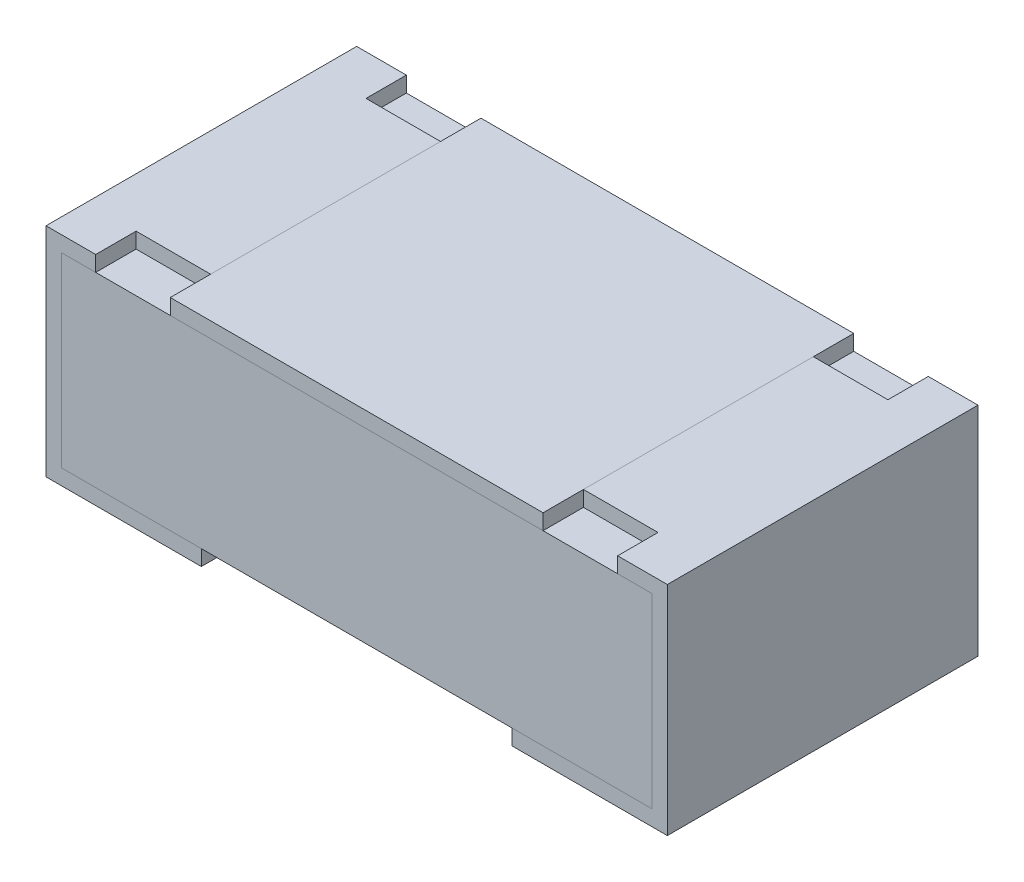
ISO-10303-21;
HEADER;
FILE_DESCRIPTION(('STEP AP214'),'2;1');
FILE_NAME('part.step','',(''),(''),'','','');
FILE_SCHEMA(('AUTOMOTIVE_DESIGN { 1 0 10303 214 1 1 1 1 }'));
ENDSEC;
DATA;
#1=APPLICATION_CONTEXT('core data for automotive mechanical design processes');
#2=APPLICATION_PROTOCOL_DEFINITION('international standard','automotive_design',2000,#1);
#3=PRODUCT_CONTEXT('',#1,'mechanical');
#4=PRODUCT('Part','Part','',(#3));
#5=PRODUCT_RELATED_PRODUCT_CATEGORY('part','',(#4));
#6=PRODUCT_DEFINITION_FORMATION('','',#4);
#7=PRODUCT_DEFINITION_CONTEXT('part definition',#1,'design');
#8=PRODUCT_DEFINITION('design','',#6,#7);
#9=PRODUCT_DEFINITION_SHAPE('','',#8);
#10=(LENGTH_UNIT() NAMED_UNIT(*) SI_UNIT(.MILLI.,.METRE.));
#11=(NAMED_UNIT(*) PLANE_ANGLE_UNIT() SI_UNIT($,.RADIAN.));
#12=(NAMED_UNIT(*) SI_UNIT($,.STERADIAN.) SOLID_ANGLE_UNIT());
#13=UNCERTAINTY_MEASURE_WITH_UNIT(LENGTH_MEASURE(1.E-05),#10,'distance_accuracy_value','');
#14=(GEOMETRIC_REPRESENTATION_CONTEXT(3) GLOBAL_UNCERTAINTY_ASSIGNED_CONTEXT((#13)) GLOBAL_UNIT_ASSIGNED_CONTEXT((#10,
#11,#12)) REPRESENTATION_CONTEXT('',''));
#15=CARTESIAN_POINT('',(0.,0.,0.));
#16=DIRECTION('',(0.,0.,1.));
#17=DIRECTION('',(1.,0.,0.));
#18=AXIS2_PLACEMENT_3D('',#15,#16,#17);
#19=CARTESIAN_POINT('',(-0.475,0.025,-0.25));
#20=DIRECTION('',(0.,-1.,0.));
#21=DIRECTION('',(0.,0.,-1.));
#22=AXIS2_PLACEMENT_3D('',#19,#20,#21);
#23=PLANE('',#22);
#24=DIRECTION('',(0.,0.,1.));
#25=VECTOR('',#24,1.);
#26=CARTESIAN_POINT('',(-0.25,0.025,-0.25));
#27=LINE('',#26,#25);
#28=CARTESIAN_POINT('',(-0.25,0.0250000000000003,-0.25));
#29=VERTEX_POINT('',#28);
#30=CARTESIAN_POINT('',(-0.25,0.025,0.25));
#31=VERTEX_POINT('',#30);
#32=EDGE_CURVE('P0_E151',#29,#31,#27,.T.);
#33=ORIENTED_EDGE('',*,*,#32,.F.);
#34=DIRECTION('',(1.,0.,0.));
#35=VECTOR('',#34,1.);
#36=CARTESIAN_POINT('',(-0.475,0.0250000000000002,-0.25));
#37=LINE('',#36,#35);
#38=CARTESIAN_POINT('',(-0.475,0.0250000000000002,-0.25));
#39=VERTEX_POINT('',#38);
#40=EDGE_CURVE('P0_E196',#39,#29,#37,.T.);
#41=ORIENTED_EDGE('',*,*,#40,.F.);
#42=DIRECTION('',(0.,0.,-1.));
#43=VECTOR('',#42,1.);
#44=CARTESIAN_POINT('',(-0.475,0.025,-0.25));
#45=LINE('',#44,#43);
#46=CARTESIAN_POINT('',(-0.475,0.0250000000000002,0.25));
#47=VERTEX_POINT('',#46);
#48=EDGE_CURVE('P0_E159',#47,#39,#45,.T.);
#49=ORIENTED_EDGE('',*,*,#48,.F.);
#50=DIRECTION('',(1.,0.,0.));
#51=VECTOR('',#50,1.);
#52=CARTESIAN_POINT('',(-0.475,0.0250000000000002,0.25));
#53=LINE('',#52,#51);
#54=EDGE_CURVE('P0_E158',#47,#31,#53,.T.);
#55=ORIENTED_EDGE('',*,*,#54,.T.);
#56=EDGE_LOOP('',(#33,#41,#49,#55));
#57=FACE_BOUND('',#56,.T.);
#58=ADVANCED_FACE('P0_F17',(#57),#23,.F.);
#59=CARTESIAN_POINT('',(-0.5,0.,0.25));
#60=DIRECTION('',(0.,1.,0.));
#61=DIRECTION('',(0.,0.,1.));
#62=AXIS2_PLACEMENT_3D('',#59,#60,#61);
#63=PLANE('',#62);
#64=DIRECTION('',(0.,0.,-1.));
#65=VECTOR('',#64,1.);
#66=CARTESIAN_POINT('',(-0.25,0.,0.25));
#67=LINE('',#66,#65);
#68=CARTESIAN_POINT('',(-0.25,0.,0.25));
#69=VERTEX_POINT('',#68);
#70=CARTESIAN_POINT('',(-0.25,0.,-0.25));
#71=VERTEX_POINT('',#70);
#72=EDGE_CURVE('P0_E11',#69,#71,#67,.T.);
#73=ORIENTED_EDGE('',*,*,#72,.F.);
#74=DIRECTION('',(1.,0.,0.));
#75=VECTOR('',#74,1.);
#76=CARTESIAN_POINT('',(-0.5,0.,0.25));
#77=LINE('',#76,#75);
#78=CARTESIAN_POINT('',(-0.5,0.,0.25));
#79=VERTEX_POINT('',#78);
#80=EDGE_CURVE('P0_E152',#79,#69,#77,.T.);
#81=ORIENTED_EDGE('',*,*,#80,.F.);
#82=DIRECTION('',(0.,0.,1.));
#83=VECTOR('',#82,1.);
#84=CARTESIAN_POINT('',(-0.5,0.,0.25));
#85=LINE('',#84,#83);
#86=CARTESIAN_POINT('',(-0.5,0.,-0.25));
#87=VERTEX_POINT('',#86);
#88=EDGE_CURVE('P0_E155',#87,#79,#85,.T.);
#89=ORIENTED_EDGE('',*,*,#88,.F.);
#90=DIRECTION('',(1.,0.,0.));
#91=VECTOR('',#90,1.);
#92=CARTESIAN_POINT('',(-0.5,0.,-0.25));
#93=LINE('',#92,#91);
#94=EDGE_CURVE('P0_E199',#87,#71,#93,.T.);
#95=ORIENTED_EDGE('',*,*,#94,.T.);
#96=EDGE_LOOP('',(#73,#81,#89,#95));
#97=FACE_BOUND('',#96,.T.);
#98=ADVANCED_FACE('P0_F19',(#97),#63,.F.);
#99=CARTESIAN_POINT('',(-0.475,0.325,-0.25));
#100=DIRECTION('',(1.,0.,0.));
#101=DIRECTION('',(0.,0.,-1.));
#102=AXIS2_PLACEMENT_3D('',#99,#100,#101);
#103=PLANE('',#102);
#104=DIRECTION('',(0.,-1.,0.));
#105=VECTOR('',#104,1.);
#106=CARTESIAN_POINT('',(-0.475,0.325,0.25));
#107=LINE('',#106,#105);
#108=CARTESIAN_POINT('',(-0.475,0.325,0.25));
#109=VERTEX_POINT('',#108);
#110=EDGE_CURVE('P0_E162',#109,#47,#107,.T.);
#111=ORIENTED_EDGE('',*,*,#110,.T.);
#112=ORIENTED_EDGE('',*,*,#48,.T.);
#113=DIRECTION('',(0.,-1.,0.));
#114=VECTOR('',#113,1.);
#115=CARTESIAN_POINT('',(-0.475,0.325,-0.25));
#116=LINE('',#115,#114);
#117=CARTESIAN_POINT('',(-0.475,0.325,-0.25));
#118=VERTEX_POINT('',#117);
#119=EDGE_CURVE('P0_E170',#118,#39,#116,.T.);
#120=ORIENTED_EDGE('',*,*,#119,.F.);
#121=DIRECTION('',(0.,0.,1.));
#122=VECTOR('',#121,1.);
#123=CARTESIAN_POINT('',(-0.475,0.325,-0.25));
#124=LINE('',#123,#122);
#125=EDGE_CURVE('P0_E166',#118,#109,#124,.T.);
#126=ORIENTED_EDGE('',*,*,#125,.T.);
#127=EDGE_LOOP('',(#111,#112,#120,#126));
#128=FACE_BOUND('',#127,.T.);
#129=ADVANCED_FACE('P0_F220',(#128),#103,.T.);
#130=CARTESIAN_POINT('',(-0.5,0.35,0.25));
#131=DIRECTION('',(-1.,0.,0.));
#132=DIRECTION('',(0.,0.,1.));
#133=AXIS2_PLACEMENT_3D('',#130,#131,#132);
#134=PLANE('',#133);
#135=DIRECTION('',(0.,-1.,0.));
#136=VECTOR('',#135,1.);
#137=CARTESIAN_POINT('',(-0.5,0.35,-0.25));
#138=LINE('',#137,#136);
#139=CARTESIAN_POINT('',(-0.5,0.35,-0.25));
#140=VERTEX_POINT('',#139);
#141=EDGE_CURVE('P0_E186',#140,#87,#138,.T.);
#142=ORIENTED_EDGE('',*,*,#141,.T.);
#143=ORIENTED_EDGE('',*,*,#88,.T.);
#144=DIRECTION('',(0.,-1.,0.));
#145=VECTOR('',#144,1.);
#146=CARTESIAN_POINT('',(-0.5,0.35,0.25));
#147=LINE('',#146,#145);
#148=CARTESIAN_POINT('',(-0.5,0.35,0.25));
#149=VERTEX_POINT('',#148);
#150=EDGE_CURVE('P0_E189',#149,#79,#147,.T.);
#151=ORIENTED_EDGE('',*,*,#150,.F.);
#152=DIRECTION('',(0.,0.,-1.));
#153=VECTOR('',#152,1.);
#154=CARTESIAN_POINT('',(-0.5,0.35,0.25));
#155=LINE('',#154,#153);
#156=EDGE_CURVE('P0_E163',#149,#140,#155,.T.);
#157=ORIENTED_EDGE('',*,*,#156,.T.);
#158=EDGE_LOOP('',(#142,#143,#151,#157));
#159=FACE_BOUND('',#158,.T.);
#160=ADVANCED_FACE('P0_F253',(#159),#134,.T.);
#161=CARTESIAN_POINT('',(-0.98812460986252,0.325,-0.25));
#162=DIRECTION('',(0.,1.,0.));
#163=DIRECTION('',(-1.,0.,0.));
#164=AXIS2_PLACEMENT_3D('',#161,#162,#163);
#165=PLANE('',#164);
#166=DIRECTION('',(-1.,0.,0.));
#167=VECTOR('',#166,1.);
#168=CARTESIAN_POINT('',(-0.3,0.325,0.185));
#169=LINE('',#168,#167);
#170=CARTESIAN_POINT('',(-0.3,0.325,0.185));
#171=VERTEX_POINT('',#170);
#172=CARTESIAN_POINT('',(-0.42,0.325,0.185));
#173=VERTEX_POINT('',#172);
#174=EDGE_CURVE('P0_E40',#171,#173,#169,.T.);
#175=ORIENTED_EDGE('',*,*,#174,.T.);
#176=DIRECTION('',(0.,0.,1.));
#177=VECTOR('',#176,1.);
#178=CARTESIAN_POINT('',(-0.42,0.325,0.25));
#179=LINE('',#178,#177);
#180=CARTESIAN_POINT('',(-0.42,0.325,0.25));
#181=VERTEX_POINT('',#180);
#182=EDGE_CURVE('P0_E114',#173,#181,#179,.T.);
#183=ORIENTED_EDGE('',*,*,#182,.T.);
#184=DIRECTION('',(1.,0.,0.));
#185=VECTOR('',#184,1.);
#186=CARTESIAN_POINT('',(-0.98812460986252,0.325,0.25));
#187=LINE('',#186,#185);
#188=EDGE_CURVE('P0_E174',#109,#181,#187,.T.);
#189=ORIENTED_EDGE('',*,*,#188,.F.);
#190=ORIENTED_EDGE('',*,*,#125,.F.);
#191=DIRECTION('',(1.,0.,0.));
#192=VECTOR('',#191,1.);
#193=CARTESIAN_POINT('',(-0.98812460986252,0.325,-0.25));
#194=LINE('',#193,#192);
#195=CARTESIAN_POINT('',(-0.42,0.325,-0.25));
#196=VERTEX_POINT('',#195);
#197=EDGE_CURVE('P0_E176',#118,#196,#194,.T.);
#198=ORIENTED_EDGE('',*,*,#197,.T.);
#199=DIRECTION('',(0.,0.,1.));
#200=VECTOR('',#199,1.);
#201=CARTESIAN_POINT('',(-0.42,0.325,-0.25));
#202=LINE('',#201,#200);
#203=CARTESIAN_POINT('',(-0.42,0.325,-0.185));
#204=VERTEX_POINT('',#203);
#205=EDGE_CURVE('P0_E135',#196,#204,#202,.T.);
#206=ORIENTED_EDGE('',*,*,#205,.T.);
#207=DIRECTION('',(1.,0.,0.));
#208=VECTOR('',#207,1.);
#209=CARTESIAN_POINT('',(-0.3,0.325,-0.185));
#210=LINE('',#209,#208);
#211=CARTESIAN_POINT('',(-0.3,0.325,-0.185));
#212=VERTEX_POINT('',#211);
#213=EDGE_CURVE('P0_E138',#204,#212,#210,.T.);
#214=ORIENTED_EDGE('',*,*,#213,.T.);
#215=DIRECTION('',(0.,0.,1.));
#216=VECTOR('',#215,1.);
#217=CARTESIAN_POINT('',(-0.3,0.325,-0.25));
#218=LINE('',#217,#216);
#219=EDGE_CURVE('P0_E125',#212,#171,#218,.T.);
#220=ORIENTED_EDGE('',*,*,#219,.T.);
#221=EDGE_LOOP('',(#175,#183,#189,#190,#198,#206,#214,#220));
#222=FACE_BOUND('',#221,.T.);
#223=ADVANCED_FACE('P0_F122',(#222),#165,.F.);
#224=CARTESIAN_POINT('',(-0.98812460986252,0.35,-0.25));
#225=DIRECTION('',(0.,0.,1.));
#226=DIRECTION('',(1.,0.,0.));
#227=AXIS2_PLACEMENT_3D('',#224,#225,#226);
#228=PLANE('',#227);
#229=DIRECTION('',(1.,0.,0.));
#230=VECTOR('',#229,1.);
#231=CARTESIAN_POINT('',(-0.98812460986252,0.35,-0.25));
#232=LINE('',#231,#230);
#233=CARTESIAN_POINT('',(-0.42,0.35,-0.25));
#234=VERTEX_POINT('',#233);
#235=EDGE_CURVE('P0_E179',#140,#234,#232,.T.);
#236=ORIENTED_EDGE('',*,*,#235,.T.);
#237=DIRECTION('',(0.,1.,0.));
#238=VECTOR('',#237,1.);
#239=CARTESIAN_POINT('',(-0.42,0.325,-0.25));
#240=LINE('',#239,#238);
#241=EDGE_CURVE('P0_E140',#196,#234,#240,.T.);
#242=ORIENTED_EDGE('',*,*,#241,.F.);
#243=ORIENTED_EDGE('',*,*,#197,.F.);
#244=ORIENTED_EDGE('',*,*,#119,.T.);
#245=ORIENTED_EDGE('',*,*,#40,.T.);
#246=DIRECTION('',(0.,1.,0.));
#247=VECTOR('',#246,1.);
#248=CARTESIAN_POINT('',(-0.25,0.175,-0.25));
#249=LINE('',#248,#247);
#250=EDGE_CURVE('P0_E149',#71,#29,#249,.T.);
#251=ORIENTED_EDGE('',*,*,#250,.F.);
#252=ORIENTED_EDGE('',*,*,#94,.F.);
#253=ORIENTED_EDGE('',*,*,#141,.F.);
#254=EDGE_LOOP('',(#236,#242,#243,#244,#245,#251,#252,#253));
#255=FACE_BOUND('',#254,.T.);
#256=ADVANCED_FACE('P0_F214',(#255),#228,.F.);
#257=CARTESIAN_POINT('',(-0.98812460986252,0.35,0.25));
#258=DIRECTION('',(0.,-1.,0.));
#259=DIRECTION('',(1.,0.,0.));
#260=AXIS2_PLACEMENT_3D('',#257,#258,#259);
#261=PLANE('',#260);
#262=DIRECTION('',(1.,0.,0.));
#263=VECTOR('',#262,1.);
#264=CARTESIAN_POINT('',(-0.98812460986252,0.35,0.25));
#265=LINE('',#264,#263);
#266=CARTESIAN_POINT('',(-0.42,0.35,0.25));
#267=VERTEX_POINT('',#266);
#268=EDGE_CURVE('P0_E167',#149,#267,#265,.T.);
#269=ORIENTED_EDGE('',*,*,#268,.T.);
#270=DIRECTION('',(0.,0.,1.));
#271=VECTOR('',#270,1.);
#272=CARTESIAN_POINT('',(-0.42,0.35,0.25));
#273=LINE('',#272,#271);
#274=CARTESIAN_POINT('',(-0.42,0.35,0.185));
#275=VERTEX_POINT('',#274);
#276=EDGE_CURVE('P0_E126',#275,#267,#273,.T.);
#277=ORIENTED_EDGE('',*,*,#276,.F.);
#278=DIRECTION('',(-1.,0.,0.));
#279=VECTOR('',#278,1.);
#280=CARTESIAN_POINT('',(-0.3,0.35,0.185));
#281=LINE('',#280,#279);
#282=CARTESIAN_POINT('',(-0.3,0.35,0.185));
#283=VERTEX_POINT('',#282);
#284=EDGE_CURVE('P0_E107',#283,#275,#281,.T.);
#285=ORIENTED_EDGE('',*,*,#284,.F.);
#286=DIRECTION('',(0.,0.,-1.));
#287=VECTOR('',#286,1.);
#288=CARTESIAN_POINT('',(-0.3,0.35,0.25));
#289=LINE('',#288,#287);
#290=CARTESIAN_POINT('',(-0.3,0.35,-0.185));
#291=VERTEX_POINT('',#290);
#292=EDGE_CURVE('P0_E132',#283,#291,#289,.T.);
#293=ORIENTED_EDGE('',*,*,#292,.T.);
#294=DIRECTION('',(1.,0.,0.));
#295=VECTOR('',#294,1.);
#296=CARTESIAN_POINT('',(-0.3,0.35,-0.185));
#297=LINE('',#296,#295);
#298=CARTESIAN_POINT('',(-0.42,0.35,-0.185));
#299=VERTEX_POINT('',#298);
#300=EDGE_CURVE('P0_E32',#299,#291,#297,.T.);
#301=ORIENTED_EDGE('',*,*,#300,.F.);
#302=DIRECTION('',(0.,0.,1.));
#303=VECTOR('',#302,1.);
#304=CARTESIAN_POINT('',(-0.42,0.35,-0.25));
#305=LINE('',#304,#303);
#306=EDGE_CURVE('P0_E141',#234,#299,#305,.T.);
#307=ORIENTED_EDGE('',*,*,#306,.F.);
#308=ORIENTED_EDGE('',*,*,#235,.F.);
#309=ORIENTED_EDGE('',*,*,#156,.F.);
#310=EDGE_LOOP('',(#269,#277,#285,#293,#301,#307,#308,#309));
#311=FACE_BOUND('',#310,.T.);
#312=ADVANCED_FACE('P0_F227',(#311),#261,.F.);
#313=CARTESIAN_POINT('',(-0.98812460986252,0.325,0.25));
#314=DIRECTION('',(0.,0.,-1.));
#315=DIRECTION('',(0.,1.,0.));
#316=AXIS2_PLACEMENT_3D('',#313,#314,#315);
#317=PLANE('',#316);
#318=ORIENTED_EDGE('',*,*,#188,.T.);
#319=DIRECTION('',(0.,1.,0.));
#320=VECTOR('',#319,1.);
#321=CARTESIAN_POINT('',(-0.42,0.325,0.25));
#322=LINE('',#321,#320);
#323=EDGE_CURVE('P0_E110',#181,#267,#322,.T.);
#324=ORIENTED_EDGE('',*,*,#323,.T.);
#325=ORIENTED_EDGE('',*,*,#268,.F.);
#326=ORIENTED_EDGE('',*,*,#150,.T.);
#327=ORIENTED_EDGE('',*,*,#80,.T.);
#328=DIRECTION('',(0.,-1.,0.));
#329=VECTOR('',#328,1.);
#330=CARTESIAN_POINT('',(-0.25,0.175,0.25));
#331=LINE('',#330,#329);
#332=EDGE_CURVE('P0_E25',#31,#69,#331,.T.);
#333=ORIENTED_EDGE('',*,*,#332,.F.);
#334=ORIENTED_EDGE('',*,*,#54,.F.);
#335=ORIENTED_EDGE('',*,*,#110,.F.);
#336=EDGE_LOOP('',(#318,#324,#325,#326,#327,#333,#334,#335));
#337=FACE_BOUND('',#336,.T.);
#338=ADVANCED_FACE('P0_F205',(#337),#317,.F.);
#339=CARTESIAN_POINT('',(-0.3,0.35,0.25));
#340=DIRECTION('',(-1.,0.,0.));
#341=DIRECTION('',(0.,0.,1.));
#342=AXIS2_PLACEMENT_3D('',#339,#340,#341);
#343=PLANE('',#342);
#344=ORIENTED_EDGE('',*,*,#292,.F.);
#345=DIRECTION('',(0.,1.,0.));
#346=VECTOR('',#345,1.);
#347=CARTESIAN_POINT('',(-0.3,0.325,0.185));
#348=LINE('',#347,#346);
#349=EDGE_CURVE('P0_E111',#171,#283,#348,.T.);
#350=ORIENTED_EDGE('',*,*,#349,.F.);
#351=ORIENTED_EDGE('',*,*,#219,.F.);
#352=DIRECTION('',(0.,1.,0.));
#353=VECTOR('',#352,1.);
#354=CARTESIAN_POINT('',(-0.3,0.325,-0.185));
#355=LINE('',#354,#353);
#356=EDGE_CURVE('P0_E130',#212,#291,#355,.T.);
#357=ORIENTED_EDGE('',*,*,#356,.T.);
#358=EDGE_LOOP('',(#344,#350,#351,#357));
#359=FACE_BOUND('',#358,.T.);
#360=ADVANCED_FACE('P0_F231',(#359),#343,.F.);
#361=CARTESIAN_POINT('',(-0.25,0.0125000000000001,0.));
#362=DIRECTION('',(1.,0.,0.));
#363=DIRECTION('',(0.,0.,-1.));
#364=AXIS2_PLACEMENT_3D('',#361,#362,#363);
#365=PLANE('',#364);
#366=ORIENTED_EDGE('',*,*,#332,.T.);
#367=ORIENTED_EDGE('',*,*,#72,.T.);
#368=ORIENTED_EDGE('',*,*,#250,.T.);
#369=ORIENTED_EDGE('',*,*,#32,.T.);
#370=EDGE_LOOP('',(#366,#367,#368,#369));
#371=FACE_BOUND('',#370,.T.);
#372=ADVANCED_FACE('P0_F211',(#371),#365,.T.);
#373=CARTESIAN_POINT('',(-0.3,0.325,-0.185));
#374=DIRECTION('',(0.,0.,1.));
#375=DIRECTION('',(1.,0.,0.));
#376=AXIS2_PLACEMENT_3D('',#373,#374,#375);
#377=PLANE('',#376);
#378=ORIENTED_EDGE('',*,*,#300,.T.);
#379=ORIENTED_EDGE('',*,*,#356,.F.);
#380=ORIENTED_EDGE('',*,*,#213,.F.);
#381=DIRECTION('',(0.,1.,0.));
#382=VECTOR('',#381,1.);
#383=CARTESIAN_POINT('',(-0.42,0.325,-0.185));
#384=LINE('',#383,#382);
#385=EDGE_CURVE('P0_E146',#204,#299,#384,.T.);
#386=ORIENTED_EDGE('',*,*,#385,.T.);
#387=EDGE_LOOP('',(#378,#379,#380,#386));
#388=FACE_BOUND('',#387,.T.);
#389=ADVANCED_FACE('P0_F233',(#388),#377,.F.);
#390=CARTESIAN_POINT('',(-0.42,0.325,-0.25));
#391=DIRECTION('',(-1.,0.,0.));
#392=DIRECTION('',(0.,-1.,0.));
#393=AXIS2_PLACEMENT_3D('',#390,#391,#392);
#394=PLANE('',#393);
#395=ORIENTED_EDGE('',*,*,#306,.T.);
#396=ORIENTED_EDGE('',*,*,#385,.F.);
#397=ORIENTED_EDGE('',*,*,#205,.F.);
#398=ORIENTED_EDGE('',*,*,#241,.T.);
#399=EDGE_LOOP('',(#395,#396,#397,#398));
#400=FACE_BOUND('',#399,.T.);
#401=ADVANCED_FACE('P0_F225',(#400),#394,.F.);
#402=CARTESIAN_POINT('',(-0.42,0.325,0.25));
#403=DIRECTION('',(-1.,0.,0.));
#404=DIRECTION('',(0.,-1.,0.));
#405=AXIS2_PLACEMENT_3D('',#402,#403,#404);
#406=PLANE('',#405);
#407=ORIENTED_EDGE('',*,*,#276,.T.);
#408=ORIENTED_EDGE('',*,*,#323,.F.);
#409=ORIENTED_EDGE('',*,*,#182,.F.);
#410=DIRECTION('',(0.,1.,0.));
#411=VECTOR('',#410,1.);
#412=CARTESIAN_POINT('',(-0.42,0.325,0.185));
#413=LINE('',#412,#411);
#414=EDGE_CURVE('P0_E103',#173,#275,#413,.T.);
#415=ORIENTED_EDGE('',*,*,#414,.T.);
#416=EDGE_LOOP('',(#407,#408,#409,#415));
#417=FACE_BOUND('',#416,.T.);
#418=ADVANCED_FACE('P0_F115',(#417),#406,.F.);
#419=CARTESIAN_POINT('',(-0.3,0.325,0.185));
#420=DIRECTION('',(0.,0.,-1.));
#421=DIRECTION('',(-1.,0.,0.));
#422=AXIS2_PLACEMENT_3D('',#419,#420,#421);
#423=PLANE('',#422);
#424=ORIENTED_EDGE('',*,*,#284,.T.);
#425=ORIENTED_EDGE('',*,*,#414,.F.);
#426=ORIENTED_EDGE('',*,*,#174,.F.);
#427=ORIENTED_EDGE('',*,*,#349,.T.);
#428=EDGE_LOOP('',(#424,#425,#426,#427));
#429=FACE_BOUND('',#428,.T.);
#430=ADVANCED_FACE('P0_F105',(#429),#423,.F.);
#431=CLOSED_SHELL('',(#58,#98,#129,#160,#223,#256,#312,#338,#360,#372,#389,#401,#418,#430));
#432=MANIFOLD_SOLID_BREP('P0_B1',#431);
#433=CARTESIAN_POINT('',(0.3,0.35,0.25));
#434=DIRECTION('',(1.,0.,0.));
#435=DIRECTION('',(0.,0.,1.));
#436=AXIS2_PLACEMENT_3D('',#433,#434,#435);
#437=PLANE('',#436);
#438=DIRECTION('',(0.,-1.,0.));
#439=VECTOR('',#438,1.);
#440=CARTESIAN_POINT('',(0.3,0.35,-0.25));
#441=LINE('',#440,#439);
#442=CARTESIAN_POINT('',(0.299999999981537,0.35,-0.25));
#443=VERTEX_POINT('',#442);
#444=CARTESIAN_POINT('',(0.299999999981537,0.325,-0.25));
#445=VERTEX_POINT('',#444);
#446=EDGE_CURVE('P1_E70',#443,#445,#441,.T.);
#447=ORIENTED_EDGE('',*,*,#446,.F.);
#448=DIRECTION('',(0.,0.,-1.));
#449=VECTOR('',#448,1.);
#450=CARTESIAN_POINT('',(0.3,0.35,0.25));
#451=LINE('',#450,#449);
#452=CARTESIAN_POINT('',(0.299999999981537,0.35,0.25));
#453=VERTEX_POINT('',#452);
#454=EDGE_CURVE('P1_E74',#453,#443,#451,.T.);
#455=ORIENTED_EDGE('',*,*,#454,.F.);
#456=DIRECTION('',(0.,1.,0.));
#457=VECTOR('',#456,1.);
#458=CARTESIAN_POINT('',(0.3,0.325,0.25));
#459=LINE('',#458,#457);
#460=CARTESIAN_POINT('',(0.299999999981537,0.325,0.25));
#461=VERTEX_POINT('',#460);
#462=EDGE_CURVE('P1_E71',#461,#453,#459,.T.);
#463=ORIENTED_EDGE('',*,*,#462,.F.);
#464=DIRECTION('',(0.,0.,1.));
#465=VECTOR('',#464,1.);
#466=CARTESIAN_POINT('',(0.3,0.325,-0.25));
#467=LINE('',#466,#465);
#468=EDGE_CURVE('P1_E60',#445,#461,#467,.T.);
#469=ORIENTED_EDGE('',*,*,#468,.F.);
#470=EDGE_LOOP('',(#447,#455,#463,#469));
#471=FACE_BOUND('',#470,.T.);
#472=ADVANCED_FACE('P1_F17',(#471),#437,.T.);
#473=CARTESIAN_POINT('',(500000.,0.325,0.249999999901436));
#474=DIRECTION('',(0.,1.,0.));
#475=DIRECTION('',(-1.,0.,0.));
#476=AXIS2_PLACEMENT_3D('',#473,#474,#475);
#477=PLANE('',#476);
#478=DIRECTION('',(-1.,0.,0.));
#479=VECTOR('',#478,1.);
#480=CARTESIAN_POINT('',(500000.,0.325,-0.250000000098564));
#481=LINE('',#480,#479);
#482=CARTESIAN_POINT('',(-0.3,0.325,-0.25));
#483=VERTEX_POINT('',#482);
#484=EDGE_CURVE('P1_E67',#445,#483,#481,.T.);
#485=ORIENTED_EDGE('',*,*,#484,.F.);
#486=ORIENTED_EDGE('',*,*,#468,.T.);
#487=DIRECTION('',(-1.,0.,0.));
#488=VECTOR('',#487,1.);
#489=CARTESIAN_POINT('',(500000.,0.325,0.249999999901436));
#490=LINE('',#489,#488);
#491=CARTESIAN_POINT('',(-0.3,0.325,0.25));
#492=VERTEX_POINT('',#491);
#493=EDGE_CURVE('P1_E64',#461,#492,#490,.T.);
#494=ORIENTED_EDGE('',*,*,#493,.T.);
#495=DIRECTION('',(0.,0.,-1.));
#496=VECTOR('',#495,1.);
#497=CARTESIAN_POINT('',(-0.3,0.325,0.25));
#498=LINE('',#497,#496);
#499=EDGE_CURVE('P1_E26',#492,#483,#498,.T.);
#500=ORIENTED_EDGE('',*,*,#499,.T.);
#501=EDGE_LOOP('',(#485,#486,#494,#500));
#502=FACE_BOUND('',#501,.T.);
#503=ADVANCED_FACE('P1_F62',(#502),#477,.F.);
#504=CARTESIAN_POINT('',(-0.3,0.325,0.25));
#505=DIRECTION('',(1.,0.,0.));
#506=DIRECTION('',(0.,0.,-1.));
#507=AXIS2_PLACEMENT_3D('',#504,#505,#506);
#508=PLANE('',#507);
#509=DIRECTION('',(0.,1.,0.));
#510=VECTOR('',#509,1.);
#511=CARTESIAN_POINT('',(-0.3,0.35,-0.25));
#512=LINE('',#511,#510);
#513=CARTESIAN_POINT('',(-0.3,0.35,-0.25));
#514=VERTEX_POINT('',#513);
#515=EDGE_CURVE('P1_E82',#483,#514,#512,.T.);
#516=ORIENTED_EDGE('',*,*,#515,.F.);
#517=ORIENTED_EDGE('',*,*,#499,.F.);
#518=DIRECTION('',(0.,-1.,0.));
#519=VECTOR('',#518,1.);
#520=CARTESIAN_POINT('',(-0.3,0.35,0.25));
#521=LINE('',#520,#519);
#522=CARTESIAN_POINT('',(-0.3,0.35,0.25));
#523=VERTEX_POINT('',#522);
#524=EDGE_CURVE('P1_E11',#523,#492,#521,.T.);
#525=ORIENTED_EDGE('',*,*,#524,.F.);
#526=DIRECTION('',(0.,0.,1.));
#527=VECTOR('',#526,1.);
#528=CARTESIAN_POINT('',(-0.3,0.35,0.25));
#529=LINE('',#528,#527);
#530=EDGE_CURVE('P1_E34',#514,#523,#529,.T.);
#531=ORIENTED_EDGE('',*,*,#530,.F.);
#532=EDGE_LOOP('',(#516,#517,#525,#531));
#533=FACE_BOUND('',#532,.T.);
#534=ADVANCED_FACE('P1_F90',(#533),#508,.F.);
#535=CARTESIAN_POINT('',(500000.,0.35,-0.250000000098564));
#536=DIRECTION('',(0.,0.,1.));
#537=DIRECTION('',(1.,0.,0.));
#538=AXIS2_PLACEMENT_3D('',#535,#536,#537);
#539=PLANE('',#538);
#540=DIRECTION('',(-1.,0.,0.));
#541=VECTOR('',#540,1.);
#542=CARTESIAN_POINT('',(500000.,0.35,-0.250000000098564));
#543=LINE('',#542,#541);
#544=EDGE_CURVE('P1_E39',#443,#514,#543,.T.);
#545=ORIENTED_EDGE('',*,*,#544,.F.);
#546=ORIENTED_EDGE('',*,*,#446,.T.);
#547=ORIENTED_EDGE('',*,*,#484,.T.);
#548=ORIENTED_EDGE('',*,*,#515,.T.);
#549=EDGE_LOOP('',(#545,#546,#547,#548));
#550=FACE_BOUND('',#549,.T.);
#551=ADVANCED_FACE('P1_F87',(#550),#539,.F.);
#552=CARTESIAN_POINT('',(500000.,0.35,0.249999999901436));
#553=DIRECTION('',(0.,0.,-1.));
#554=DIRECTION('',(-1.,0.,0.));
#555=AXIS2_PLACEMENT_3D('',#552,#553,#554);
#556=PLANE('',#555);
#557=ORIENTED_EDGE('',*,*,#493,.F.);
#558=ORIENTED_EDGE('',*,*,#462,.T.);
#559=DIRECTION('',(-1.,0.,0.));
#560=VECTOR('',#559,1.);
#561=CARTESIAN_POINT('',(500000.,0.35,0.249999999901436));
#562=LINE('',#561,#560);
#563=EDGE_CURVE('P1_E21',#453,#523,#562,.T.);
#564=ORIENTED_EDGE('',*,*,#563,.T.);
#565=ORIENTED_EDGE('',*,*,#524,.T.);
#566=EDGE_LOOP('',(#557,#558,#564,#565));
#567=FACE_BOUND('',#566,.T.);
#568=ADVANCED_FACE('P1_F19',(#567),#556,.F.);
#569=CARTESIAN_POINT('',(500000.,0.35,0.249999999901436));
#570=DIRECTION('',(0.,-1.,0.));
#571=DIRECTION('',(1.,0.,0.));
#572=AXIS2_PLACEMENT_3D('',#569,#570,#571);
#573=PLANE('',#572);
#574=ORIENTED_EDGE('',*,*,#563,.F.);
#575=ORIENTED_EDGE('',*,*,#454,.T.);
#576=ORIENTED_EDGE('',*,*,#544,.T.);
#577=ORIENTED_EDGE('',*,*,#530,.T.);
#578=EDGE_LOOP('',(#574,#575,#576,#577));
#579=FACE_BOUND('',#578,.T.);
#580=ADVANCED_FACE('P1_F102',(#579),#573,.F.);
#581=CLOSED_SHELL('',(#472,#503,#534,#551,#568,#580));
#582=MANIFOLD_SOLID_BREP('P1_B1',#581);
#583=CARTESIAN_POINT('',(-0.475,0.35,-0.25));
#584=DIRECTION('',(1.,0.,0.));
#585=DIRECTION('',(0.,0.,-1.));
#586=AXIS2_PLACEMENT_3D('',#583,#584,#585);
#587=PLANE('',#586);
#588=DIRECTION('',(0.,-1.,0.));
#589=VECTOR('',#588,1.);
#590=CARTESIAN_POINT('',(-0.475,0.35,0.25));
#591=LINE('',#590,#589);
#592=CARTESIAN_POINT('',(-0.475,0.325,0.25));
#593=VERTEX_POINT('',#592);
#594=CARTESIAN_POINT('',(-0.475,0.025,0.25));
#595=VERTEX_POINT('',#594);
#596=EDGE_CURVE('P2_E11',#593,#595,#591,.T.);
#597=ORIENTED_EDGE('',*,*,#596,.F.);
#598=DIRECTION('',(0.,0.,1.));
#599=VECTOR('',#598,1.);
#600=CARTESIAN_POINT('',(-0.475,0.325,-0.25));
#601=LINE('',#600,#599);
#602=CARTESIAN_POINT('',(-0.475,0.325,-0.25));
#603=VERTEX_POINT('',#602);
#604=EDGE_CURVE('P2_E56',#603,#593,#601,.T.);
#605=ORIENTED_EDGE('',*,*,#604,.F.);
#606=DIRECTION('',(0.,-1.,0.));
#607=VECTOR('',#606,1.);
#608=CARTESIAN_POINT('',(-0.475,0.35,-0.25));
#609=LINE('',#608,#607);
#610=CARTESIAN_POINT('',(-0.475,0.025,-0.25));
#611=VERTEX_POINT('',#610);
#612=EDGE_CURVE('P2_E38',#603,#611,#609,.T.);
#613=ORIENTED_EDGE('',*,*,#612,.T.);
#614=DIRECTION('',(0.,0.,1.));
#615=VECTOR('',#614,1.);
#616=CARTESIAN_POINT('',(-0.475,0.025,-0.25));
#617=LINE('',#616,#615);
#618=EDGE_CURVE('P2_E70',#611,#595,#617,.T.);
#619=ORIENTED_EDGE('',*,*,#618,.T.);
#620=EDGE_LOOP('',(#597,#605,#613,#619));
#621=FACE_BOUND('',#620,.T.);
#622=ADVANCED_FACE('P2_F17',(#621),#587,.F.);
#623=CARTESIAN_POINT('',(0.475,0.35,0.25));
#624=DIRECTION('',(0.,0.,-1.));
#625=DIRECTION('',(-1.,0.,0.));
#626=AXIS2_PLACEMENT_3D('',#623,#624,#625);
#627=PLANE('',#626);
#628=DIRECTION('',(0.,-1.,0.));
#629=VECTOR('',#628,1.);
#630=CARTESIAN_POINT('',(0.475,0.35,0.25));
#631=LINE('',#630,#629);
#632=CARTESIAN_POINT('',(0.475,0.325,0.25));
#633=VERTEX_POINT('',#632);
#634=CARTESIAN_POINT('',(0.475,0.025,0.25));
#635=VERTEX_POINT('',#634);
#636=EDGE_CURVE('P2_E24',#633,#635,#631,.T.);
#637=ORIENTED_EDGE('',*,*,#636,.F.);
#638=DIRECTION('',(1.,0.,0.));
#639=VECTOR('',#638,1.);
#640=CARTESIAN_POINT('',(-0.475,0.325,0.25));
#641=LINE('',#640,#639);
#642=EDGE_CURVE('P2_E61',#593,#633,#641,.T.);
#643=ORIENTED_EDGE('',*,*,#642,.F.);
#644=ORIENTED_EDGE('',*,*,#596,.T.);
#645=DIRECTION('',(-1.,0.,0.));
#646=VECTOR('',#645,1.);
#647=CARTESIAN_POINT('',(-0.475,0.025,0.25));
#648=LINE('',#647,#646);
#649=EDGE_CURVE('P2_E86',#635,#595,#648,.T.);
#650=ORIENTED_EDGE('',*,*,#649,.F.);
#651=EDGE_LOOP('',(#637,#643,#644,#650));
#652=FACE_BOUND('',#651,.T.);
#653=ADVANCED_FACE('P2_F87',(#652),#627,.F.);
#654=CARTESIAN_POINT('',(0.475,0.35,-0.25));
#655=DIRECTION('',(-1.,0.,0.));
#656=DIRECTION('',(0.,0.,1.));
#657=AXIS2_PLACEMENT_3D('',#654,#655,#656);
#658=PLANE('',#657);
#659=DIRECTION('',(0.,-1.,0.));
#660=VECTOR('',#659,1.);
#661=CARTESIAN_POINT('',(0.475,0.35,-0.25));
#662=LINE('',#661,#660);
#663=CARTESIAN_POINT('',(0.475,0.325,-0.25));
#664=VERTEX_POINT('',#663);
#665=CARTESIAN_POINT('',(0.475,0.025,-0.25));
#666=VERTEX_POINT('',#665);
#667=EDGE_CURVE('P2_E69',#664,#666,#662,.T.);
#668=ORIENTED_EDGE('',*,*,#667,.F.);
#669=DIRECTION('',(0.,0.,1.));
#670=VECTOR('',#669,1.);
#671=CARTESIAN_POINT('',(0.475,0.325,-0.25));
#672=LINE('',#671,#670);
#673=EDGE_CURVE('P2_E59',#664,#633,#672,.T.);
#674=ORIENTED_EDGE('',*,*,#673,.T.);
#675=ORIENTED_EDGE('',*,*,#636,.T.);
#676=DIRECTION('',(0.,0.,1.));
#677=VECTOR('',#676,1.);
#678=CARTESIAN_POINT('',(0.475,0.025,-0.25));
#679=LINE('',#678,#677);
#680=EDGE_CURVE('P2_E73',#666,#635,#679,.T.);
#681=ORIENTED_EDGE('',*,*,#680,.F.);
#682=EDGE_LOOP('',(#668,#674,#675,#681));
#683=FACE_BOUND('',#682,.T.);
#684=ADVANCED_FACE('P2_F80',(#683),#658,.F.);
#685=CARTESIAN_POINT('',(0.475,0.35,-0.25));
#686=DIRECTION('',(0.,0.,1.));
#687=DIRECTION('',(1.,0.,0.));
#688=AXIS2_PLACEMENT_3D('',#685,#686,#687);
#689=PLANE('',#688);
#690=ORIENTED_EDGE('',*,*,#612,.F.);
#691=DIRECTION('',(1.,0.,0.));
#692=VECTOR('',#691,1.);
#693=CARTESIAN_POINT('',(-0.475,0.325,-0.25));
#694=LINE('',#693,#692);
#695=EDGE_CURVE('P2_E31',#603,#664,#694,.T.);
#696=ORIENTED_EDGE('',*,*,#695,.T.);
#697=ORIENTED_EDGE('',*,*,#667,.T.);
#698=DIRECTION('',(-1.,0.,0.));
#699=VECTOR('',#698,1.);
#700=CARTESIAN_POINT('',(-0.475,0.025,-0.25));
#701=LINE('',#700,#699);
#702=EDGE_CURVE('P2_E68',#666,#611,#701,.T.);
#703=ORIENTED_EDGE('',*,*,#702,.T.);
#704=EDGE_LOOP('',(#690,#696,#697,#703));
#705=FACE_BOUND('',#704,.T.);
#706=ADVANCED_FACE('P2_F66',(#705),#689,.F.);
#707=CARTESIAN_POINT('',(-0.475,0.025,-0.25));
#708=DIRECTION('',(0.,1.,0.));
#709=DIRECTION('',(0.,0.,1.));
#710=AXIS2_PLACEMENT_3D('',#707,#708,#709);
#711=PLANE('',#710);
#712=ORIENTED_EDGE('',*,*,#649,.T.);
#713=ORIENTED_EDGE('',*,*,#618,.F.);
#714=ORIENTED_EDGE('',*,*,#702,.F.);
#715=ORIENTED_EDGE('',*,*,#680,.T.);
#716=EDGE_LOOP('',(#712,#713,#714,#715));
#717=FACE_BOUND('',#716,.T.);
#718=ADVANCED_FACE('P2_F85',(#717),#711,.F.);
#719=CARTESIAN_POINT('',(-0.475,0.325,-0.25));
#720=DIRECTION('',(0.,-1.,0.));
#721=DIRECTION('',(1.,0.,0.));
#722=AXIS2_PLACEMENT_3D('',#719,#720,#721);
#723=PLANE('',#722);
#724=ORIENTED_EDGE('',*,*,#642,.T.);
#725=ORIENTED_EDGE('',*,*,#673,.F.);
#726=ORIENTED_EDGE('',*,*,#695,.F.);
#727=ORIENTED_EDGE('',*,*,#604,.T.);
#728=EDGE_LOOP('',(#724,#725,#726,#727));
#729=FACE_BOUND('',#728,.T.);
#730=ADVANCED_FACE('P2_F55',(#729),#723,.F.);
#731=CLOSED_SHELL('',(#622,#653,#684,#706,#718,#730));
#732=MANIFOLD_SOLID_BREP('P2_B1',#731);
#733=CARTESIAN_POINT('',(0.475,0.0249999999999999,-0.25));
#734=DIRECTION('',(0.,-1.,0.));
#735=DIRECTION('',(0.,0.,-1.));
#736=AXIS2_PLACEMENT_3D('',#733,#734,#735);
#737=PLANE('',#736);
#738=DIRECTION('',(0.,0.,1.));
#739=VECTOR('',#738,1.);
#740=CARTESIAN_POINT('',(0.25,0.0249999999999999,-0.25));
#741=LINE('',#740,#739);
#742=CARTESIAN_POINT('',(0.25,0.0250000000000002,-0.25));
#743=VERTEX_POINT('',#742);
#744=CARTESIAN_POINT('',(0.25,0.0249999999999999,0.25));
#745=VERTEX_POINT('',#744);
#746=EDGE_CURVE('P3_E170',#743,#745,#741,.T.);
#747=ORIENTED_EDGE('',*,*,#746,.T.);
#748=DIRECTION('',(-1.,0.,0.));
#749=VECTOR('',#748,1.);
#750=CARTESIAN_POINT('',(0.475,0.0250000000000001,0.25));
#751=LINE('',#750,#749);
#752=CARTESIAN_POINT('',(0.475,0.0250000000000001,0.25));
#753=VERTEX_POINT('',#752);
#754=EDGE_CURVE('P3_E154',#753,#745,#751,.T.);
#755=ORIENTED_EDGE('',*,*,#754,.F.);
#756=DIRECTION('',(0.,0.,-1.));
#757=VECTOR('',#756,1.);
#758=CARTESIAN_POINT('',(0.475,0.0249999999999999,-0.25));
#759=LINE('',#758,#757);
#760=CARTESIAN_POINT('',(0.475,0.0250000000000001,-0.25));
#761=VERTEX_POINT('',#760);
#762=EDGE_CURVE('P3_E153',#753,#761,#759,.T.);
#763=ORIENTED_EDGE('',*,*,#762,.T.);
#764=DIRECTION('',(-1.,0.,0.));
#765=VECTOR('',#764,1.);
#766=CARTESIAN_POINT('',(0.475,0.0250000000000001,-0.25));
#767=LINE('',#766,#765);
#768=EDGE_CURVE('P3_E157',#761,#743,#767,.T.);
#769=ORIENTED_EDGE('',*,*,#768,.T.);
#770=EDGE_LOOP('',(#747,#755,#763,#769));
#771=FACE_BOUND('',#770,.T.);
#772=ADVANCED_FACE('P3_F17',(#771),#737,.F.);
#773=CARTESIAN_POINT('',(0.5,0.,0.25));
#774=DIRECTION('',(0.,1.,0.));
#775=DIRECTION('',(0.,0.,1.));
#776=AXIS2_PLACEMENT_3D('',#773,#774,#775);
#777=PLANE('',#776);
#778=DIRECTION('',(0.,0.,-1.));
#779=VECTOR('',#778,1.);
#780=CARTESIAN_POINT('',(0.25,0.,0.25));
#781=LINE('',#780,#779);
#782=CARTESIAN_POINT('',(0.25,0.,0.25));
#783=VERTEX_POINT('',#782);
#784=CARTESIAN_POINT('',(0.25,0.,-0.25));
#785=VERTEX_POINT('',#784);
#786=EDGE_CURVE('P3_E11',#783,#785,#781,.T.);
#787=ORIENTED_EDGE('',*,*,#786,.T.);
#788=DIRECTION('',(-1.,0.,0.));
#789=VECTOR('',#788,1.);
#790=CARTESIAN_POINT('',(0.5,0.,-0.25));
#791=LINE('',#790,#789);
#792=CARTESIAN_POINT('',(0.5,0.,-0.25));
#793=VERTEX_POINT('',#792);
#794=EDGE_CURVE('P3_E161',#793,#785,#791,.T.);
#795=ORIENTED_EDGE('',*,*,#794,.F.);
#796=DIRECTION('',(0.,0.,1.));
#797=VECTOR('',#796,1.);
#798=CARTESIAN_POINT('',(0.5,0.,0.25));
#799=LINE('',#798,#797);
#800=CARTESIAN_POINT('',(0.5,0.,0.25));
#801=VERTEX_POINT('',#800);
#802=EDGE_CURVE('P3_E158',#793,#801,#799,.T.);
#803=ORIENTED_EDGE('',*,*,#802,.T.);
#804=DIRECTION('',(-1.,0.,0.));
#805=VECTOR('',#804,1.);
#806=CARTESIAN_POINT('',(0.5,0.,0.25));
#807=LINE('',#806,#805);
#808=EDGE_CURVE('P3_E163',#801,#783,#807,.T.);
#809=ORIENTED_EDGE('',*,*,#808,.T.);
#810=EDGE_LOOP('',(#787,#795,#803,#809));
#811=FACE_BOUND('',#810,.T.);
#812=ADVANCED_FACE('P3_F19',(#811),#777,.F.);
#813=CARTESIAN_POINT('',(0.475,0.325,-0.25));
#814=DIRECTION('',(-1.,0.,0.));
#815=DIRECTION('',(0.,0.,-1.));
#816=AXIS2_PLACEMENT_3D('',#813,#814,#815);
#817=PLANE('',#816);
#818=DIRECTION('',(0.,-1.,0.));
#819=VECTOR('',#818,1.);
#820=CARTESIAN_POINT('',(0.475,0.325,0.25));
#821=LINE('',#820,#819);
#822=CARTESIAN_POINT('',(0.475,0.325,0.25));
#823=VERTEX_POINT('',#822);
#824=EDGE_CURVE('P3_E151',#823,#753,#821,.T.);
#825=ORIENTED_EDGE('',*,*,#824,.F.);
#826=DIRECTION('',(0.,0.,1.));
#827=VECTOR('',#826,1.);
#828=CARTESIAN_POINT('',(0.475,0.325,-0.25));
#829=LINE('',#828,#827);
#830=CARTESIAN_POINT('',(0.475,0.325,-0.25));
#831=VERTEX_POINT('',#830);
#832=EDGE_CURVE('P3_E128',#831,#823,#829,.T.);
#833=ORIENTED_EDGE('',*,*,#832,.F.);
#834=DIRECTION('',(0.,-1.,0.));
#835=VECTOR('',#834,1.);
#836=CARTESIAN_POINT('',(0.475,0.325,-0.25));
#837=LINE('',#836,#835);
#838=EDGE_CURVE('P3_E145',#831,#761,#837,.T.);
#839=ORIENTED_EDGE('',*,*,#838,.T.);
#840=ORIENTED_EDGE('',*,*,#762,.F.);
#841=EDGE_LOOP('',(#825,#833,#839,#840));
#842=FACE_BOUND('',#841,.T.);
#843=ADVANCED_FACE('P3_F242',(#842),#817,.T.);
#844=CARTESIAN_POINT('',(0.5,0.35,0.25));
#845=DIRECTION('',(1.,0.,0.));
#846=DIRECTION('',(0.,0.,1.));
#847=AXIS2_PLACEMENT_3D('',#844,#845,#846);
#848=PLANE('',#847);
#849=DIRECTION('',(0.,-1.,0.));
#850=VECTOR('',#849,1.);
#851=CARTESIAN_POINT('',(0.5,0.35,-0.25));
#852=LINE('',#851,#850);
#853=CARTESIAN_POINT('',(0.5,0.35,-0.25));
#854=VERTEX_POINT('',#853);
#855=EDGE_CURVE('P3_E147',#854,#793,#852,.T.);
#856=ORIENTED_EDGE('',*,*,#855,.F.);
#857=DIRECTION('',(0.,0.,-1.));
#858=VECTOR('',#857,1.);
#859=CARTESIAN_POINT('',(0.5,0.35,0.25));
#860=LINE('',#859,#858);
#861=CARTESIAN_POINT('',(0.5,0.35,0.25));
#862=VERTEX_POINT('',#861);
#863=EDGE_CURVE('P3_E144',#862,#854,#860,.T.);
#864=ORIENTED_EDGE('',*,*,#863,.F.);
#865=DIRECTION('',(0.,-1.,0.));
#866=VECTOR('',#865,1.);
#867=CARTESIAN_POINT('',(0.5,0.35,0.25));
#868=LINE('',#867,#866);
#869=EDGE_CURVE('P3_E149',#862,#801,#868,.T.);
#870=ORIENTED_EDGE('',*,*,#869,.T.);
#871=ORIENTED_EDGE('',*,*,#802,.F.);
#872=EDGE_LOOP('',(#856,#864,#870,#871));
#873=FACE_BOUND('',#872,.T.);
#874=ADVANCED_FACE('P3_F244',(#873),#848,.T.);
#875=CARTESIAN_POINT('',(0.98812460986252,0.325,-0.25));
#876=DIRECTION('',(0.,1.,0.));
#877=DIRECTION('',(1.,0.,0.));
#878=AXIS2_PLACEMENT_3D('',#875,#876,#877);
#879=PLANE('',#878);
#880=DIRECTION('',(0.,0.,-1.));
#881=VECTOR('',#880,1.);
#882=CARTESIAN_POINT('',(0.42,0.325,0.25));
#883=LINE('',#882,#881);
#884=CARTESIAN_POINT('',(0.42,0.325,0.25));
#885=VERTEX_POINT('',#884);
#886=CARTESIAN_POINT('',(0.42,0.325,0.185));
#887=VERTEX_POINT('',#886);
#888=EDGE_CURVE('P3_E105',#885,#887,#883,.T.);
#889=ORIENTED_EDGE('',*,*,#888,.T.);
#890=DIRECTION('',(-1.,0.,0.));
#891=VECTOR('',#890,1.);
#892=CARTESIAN_POINT('',(0.3,0.325,0.185));
#893=LINE('',#892,#891);
#894=CARTESIAN_POINT('',(0.3,0.325,0.185));
#895=VERTEX_POINT('',#894);
#896=EDGE_CURVE('P3_E116',#887,#895,#893,.T.);
#897=ORIENTED_EDGE('',*,*,#896,.T.);
#898=DIRECTION('',(0.,0.,1.));
#899=VECTOR('',#898,1.);
#900=CARTESIAN_POINT('',(0.3,0.325,-0.25));
#901=LINE('',#900,#899);
#902=CARTESIAN_POINT('',(0.3,0.325,-0.185));
#903=VERTEX_POINT('',#902);
#904=EDGE_CURVE('P3_E131',#903,#895,#901,.T.);
#905=ORIENTED_EDGE('',*,*,#904,.F.);
#906=DIRECTION('',(1.,0.,0.));
#907=VECTOR('',#906,1.);
#908=CARTESIAN_POINT('',(0.3,0.325,-0.185));
#909=LINE('',#908,#907);
#910=CARTESIAN_POINT('',(0.42,0.325,-0.185));
#911=VERTEX_POINT('',#910);
#912=EDGE_CURVE('P3_E32',#903,#911,#909,.T.);
#913=ORIENTED_EDGE('',*,*,#912,.T.);
#914=DIRECTION('',(0.,0.,-1.));
#915=VECTOR('',#914,1.);
#916=CARTESIAN_POINT('',(0.42,0.325,-0.25));
#917=LINE('',#916,#915);
#918=CARTESIAN_POINT('',(0.42,0.325,-0.25));
#919=VERTEX_POINT('',#918);
#920=EDGE_CURVE('P3_E196',#911,#919,#917,.T.);
#921=ORIENTED_EDGE('',*,*,#920,.T.);
#922=DIRECTION('',(-1.,0.,0.));
#923=VECTOR('',#922,1.);
#924=CARTESIAN_POINT('',(0.98812460986252,0.325,-0.25));
#925=LINE('',#924,#923);
#926=EDGE_CURVE('P3_E130',#831,#919,#925,.T.);
#927=ORIENTED_EDGE('',*,*,#926,.F.);
#928=ORIENTED_EDGE('',*,*,#832,.T.);
#929=DIRECTION('',(-1.,0.,0.));
#930=VECTOR('',#929,1.);
#931=CARTESIAN_POINT('',(0.98812460986252,0.325,0.25));
#932=LINE('',#931,#930);
#933=EDGE_CURVE('P3_E121',#823,#885,#932,.T.);
#934=ORIENTED_EDGE('',*,*,#933,.T.);
#935=EDGE_LOOP('',(#889,#897,#905,#913,#921,#927,#928,#934));
#936=FACE_BOUND('',#935,.T.);
#937=ADVANCED_FACE('P3_F126',(#936),#879,.F.);
#938=CARTESIAN_POINT('',(0.98812460986252,0.35,-0.25));
#939=DIRECTION('',(0.,0.,1.));
#940=DIRECTION('',(-1.,0.,0.));
#941=AXIS2_PLACEMENT_3D('',#938,#939,#940);
#942=PLANE('',#941);
#943=ORIENTED_EDGE('',*,*,#926,.T.);
#944=DIRECTION('',(0.,1.,0.));
#945=VECTOR('',#944,1.);
#946=CARTESIAN_POINT('',(0.42,0.325,-0.25));
#947=LINE('',#946,#945);
#948=CARTESIAN_POINT('',(0.42,0.35,-0.25));
#949=VERTEX_POINT('',#948);
#950=EDGE_CURVE('P3_E204',#919,#949,#947,.T.);
#951=ORIENTED_EDGE('',*,*,#950,.T.);
#952=DIRECTION('',(-1.,0.,0.));
#953=VECTOR('',#952,1.);
#954=CARTESIAN_POINT('',(0.98812460986252,0.35,-0.25));
#955=LINE('',#954,#953);
#956=EDGE_CURVE('P3_E134',#854,#949,#955,.T.);
#957=ORIENTED_EDGE('',*,*,#956,.F.);
#958=ORIENTED_EDGE('',*,*,#855,.T.);
#959=ORIENTED_EDGE('',*,*,#794,.T.);
#960=DIRECTION('',(0.,1.,0.));
#961=VECTOR('',#960,1.);
#962=CARTESIAN_POINT('',(0.25,0.175,-0.25));
#963=LINE('',#962,#961);
#964=EDGE_CURVE('P3_E165',#785,#743,#963,.T.);
#965=ORIENTED_EDGE('',*,*,#964,.T.);
#966=ORIENTED_EDGE('',*,*,#768,.F.);
#967=ORIENTED_EDGE('',*,*,#838,.F.);
#968=EDGE_LOOP('',(#943,#951,#957,#958,#959,#965,#966,#967));
#969=FACE_BOUND('',#968,.T.);
#970=ADVANCED_FACE('P3_F217',(#969),#942,.F.);
#971=CARTESIAN_POINT('',(0.98812460986252,0.35,0.25));
#972=DIRECTION('',(0.,-1.,0.));
#973=DIRECTION('',(-1.,0.,0.));
#974=AXIS2_PLACEMENT_3D('',#971,#972,#973);
#975=PLANE('',#974);
#976=DIRECTION('',(0.,0.,-1.));
#977=VECTOR('',#976,1.);
#978=CARTESIAN_POINT('',(0.3,0.35,0.25));
#979=LINE('',#978,#977);
#980=CARTESIAN_POINT('',(0.3,0.35,0.185));
#981=VERTEX_POINT('',#980);
#982=CARTESIAN_POINT('',(0.3,0.35,-0.185));
#983=VERTEX_POINT('',#982);
#984=EDGE_CURVE('P3_E137',#981,#983,#979,.T.);
#985=ORIENTED_EDGE('',*,*,#984,.F.);
#986=DIRECTION('',(-1.,0.,0.));
#987=VECTOR('',#986,1.);
#988=CARTESIAN_POINT('',(0.3,0.35,0.185));
#989=LINE('',#988,#987);
#990=CARTESIAN_POINT('',(0.42,0.35,0.185));
#991=VERTEX_POINT('',#990);
#992=EDGE_CURVE('P3_E40',#991,#981,#989,.T.);
#993=ORIENTED_EDGE('',*,*,#992,.F.);
#994=DIRECTION('',(0.,0.,-1.));
#995=VECTOR('',#994,1.);
#996=CARTESIAN_POINT('',(0.42,0.35,0.25));
#997=LINE('',#996,#995);
#998=CARTESIAN_POINT('',(0.42,0.35,0.25));
#999=VERTEX_POINT('',#998);
#1000=EDGE_CURVE('P3_E206',#999,#991,#997,.T.);
#1001=ORIENTED_EDGE('',*,*,#1000,.F.);
#1002=DIRECTION('',(-1.,0.,0.));
#1003=VECTOR('',#1002,1.);
#1004=CARTESIAN_POINT('',(0.98812460986252,0.35,0.25));
#1005=LINE('',#1004,#1003);
#1006=EDGE_CURVE('P3_E124',#862,#999,#1005,.T.);
#1007=ORIENTED_EDGE('',*,*,#1006,.F.);
#1008=ORIENTED_EDGE('',*,*,#863,.T.);
#1009=ORIENTED_EDGE('',*,*,#956,.T.);
#1010=DIRECTION('',(0.,0.,-1.));
#1011=VECTOR('',#1010,1.);
#1012=CARTESIAN_POINT('',(0.42,0.35,-0.25));
#1013=LINE('',#1012,#1011);
#1014=CARTESIAN_POINT('',(0.42,0.35,-0.185));
#1015=VERTEX_POINT('',#1014);
#1016=EDGE_CURVE('P3_E197',#1015,#949,#1013,.T.);
#1017=ORIENTED_EDGE('',*,*,#1016,.F.);
#1018=DIRECTION('',(1.,0.,0.));
#1019=VECTOR('',#1018,1.);
#1020=CARTESIAN_POINT('',(0.3,0.35,-0.185));
#1021=LINE('',#1020,#1019);
#1022=EDGE_CURVE('P3_E200',#983,#1015,#1021,.T.);
#1023=ORIENTED_EDGE('',*,*,#1022,.F.);
#1024=EDGE_LOOP('',(#985,#993,#1001,#1007,#1008,#1009,#1017,#1023));
#1025=FACE_BOUND('',#1024,.T.);
#1026=ADVANCED_FACE('P3_F215',(#1025),#975,.F.);
#1027=CARTESIAN_POINT('',(0.98812460986252,0.325,0.25));
#1028=DIRECTION('',(0.,0.,-1.));
#1029=DIRECTION('',(0.,1.,0.));
#1030=AXIS2_PLACEMENT_3D('',#1027,#1028,#1029);
#1031=PLANE('',#1030);
#1032=ORIENTED_EDGE('',*,*,#1006,.T.);
#1033=DIRECTION('',(0.,1.,0.));
#1034=VECTOR('',#1033,1.);
#1035=CARTESIAN_POINT('',(0.42,0.325,0.25));
#1036=LINE('',#1035,#1034);
#1037=EDGE_CURVE('P3_E109',#885,#999,#1036,.T.);
#1038=ORIENTED_EDGE('',*,*,#1037,.F.);
#1039=ORIENTED_EDGE('',*,*,#933,.F.);
#1040=ORIENTED_EDGE('',*,*,#824,.T.);
#1041=ORIENTED_EDGE('',*,*,#754,.T.);
#1042=DIRECTION('',(0.,-1.,0.));
#1043=VECTOR('',#1042,1.);
#1044=CARTESIAN_POINT('',(0.25,0.175,0.25));
#1045=LINE('',#1044,#1043);
#1046=EDGE_CURVE('P3_E25',#745,#783,#1045,.T.);
#1047=ORIENTED_EDGE('',*,*,#1046,.T.);
#1048=ORIENTED_EDGE('',*,*,#808,.F.);
#1049=ORIENTED_EDGE('',*,*,#869,.F.);
#1050=EDGE_LOOP('',(#1032,#1038,#1039,#1040,#1041,#1047,#1048,#1049));
#1051=FACE_BOUND('',#1050,.T.);
#1052=ADVANCED_FACE('P3_F120',(#1051),#1031,.F.);
#1053=CARTESIAN_POINT('',(0.3,0.35,0.25));
#1054=DIRECTION('',(1.,0.,0.));
#1055=DIRECTION('',(0.,0.,1.));
#1056=AXIS2_PLACEMENT_3D('',#1053,#1054,#1055);
#1057=PLANE('',#1056);
#1058=ORIENTED_EDGE('',*,*,#904,.T.);
#1059=DIRECTION('',(0.,1.,0.));
#1060=VECTOR('',#1059,1.);
#1061=CARTESIAN_POINT('',(0.3,0.325,0.185));
#1062=LINE('',#1061,#1060);
#1063=EDGE_CURVE('P3_E187',#895,#981,#1062,.T.);
#1064=ORIENTED_EDGE('',*,*,#1063,.T.);
#1065=ORIENTED_EDGE('',*,*,#984,.T.);
#1066=DIRECTION('',(0.,1.,0.));
#1067=VECTOR('',#1066,1.);
#1068=CARTESIAN_POINT('',(0.3,0.325,-0.185));
#1069=LINE('',#1068,#1067);
#1070=EDGE_CURVE('P3_E177',#903,#983,#1069,.T.);
#1071=ORIENTED_EDGE('',*,*,#1070,.F.);
#1072=EDGE_LOOP('',(#1058,#1064,#1065,#1071));
#1073=FACE_BOUND('',#1072,.T.);
#1074=ADVANCED_FACE('P3_F219',(#1073),#1057,.F.);
#1075=CARTESIAN_POINT('',(0.25,0.0125000000000001,0.));
#1076=DIRECTION('',(-1.,0.,0.));
#1077=DIRECTION('',(0.,0.,-1.));
#1078=AXIS2_PLACEMENT_3D('',#1075,#1076,#1077);
#1079=PLANE('',#1078);
#1080=ORIENTED_EDGE('',*,*,#1046,.F.);
#1081=ORIENTED_EDGE('',*,*,#746,.F.);
#1082=ORIENTED_EDGE('',*,*,#964,.F.);
#1083=ORIENTED_EDGE('',*,*,#786,.F.);
#1084=EDGE_LOOP('',(#1080,#1081,#1082,#1083));
#1085=FACE_BOUND('',#1084,.T.);
#1086=ADVANCED_FACE('P3_F221',(#1085),#1079,.T.);
#1087=CARTESIAN_POINT('',(0.42,0.325,-0.25));
#1088=DIRECTION('',(1.,0.,0.));
#1089=DIRECTION('',(0.,1.,0.));
#1090=AXIS2_PLACEMENT_3D('',#1087,#1088,#1089);
#1091=PLANE('',#1090);
#1092=ORIENTED_EDGE('',*,*,#1016,.T.);
#1093=ORIENTED_EDGE('',*,*,#950,.F.);
#1094=ORIENTED_EDGE('',*,*,#920,.F.);
#1095=DIRECTION('',(0.,1.,0.));
#1096=VECTOR('',#1095,1.);
#1097=CARTESIAN_POINT('',(0.42,0.325,-0.185));
#1098=LINE('',#1097,#1096);
#1099=EDGE_CURVE('P3_E207',#911,#1015,#1098,.T.);
#1100=ORIENTED_EDGE('',*,*,#1099,.T.);
#1101=EDGE_LOOP('',(#1092,#1093,#1094,#1100));
#1102=FACE_BOUND('',#1101,.T.);
#1103=ADVANCED_FACE('P3_F216',(#1102),#1091,.F.);
#1104=CARTESIAN_POINT('',(0.3,0.325,-0.185));
#1105=DIRECTION('',(0.,0.,1.));
#1106=DIRECTION('',(1.,0.,0.));
#1107=AXIS2_PLACEMENT_3D('',#1104,#1105,#1106);
#1108=PLANE('',#1107);
#1109=ORIENTED_EDGE('',*,*,#1022,.T.);
#1110=ORIENTED_EDGE('',*,*,#1099,.F.);
#1111=ORIENTED_EDGE('',*,*,#912,.F.);
#1112=ORIENTED_EDGE('',*,*,#1070,.T.);
#1113=EDGE_LOOP('',(#1109,#1110,#1111,#1112));
#1114=FACE_BOUND('',#1113,.T.);
#1115=ADVANCED_FACE('P3_F211',(#1114),#1108,.F.);
#1116=CARTESIAN_POINT('',(0.3,0.325,0.185));
#1117=DIRECTION('',(0.,0.,-1.));
#1118=DIRECTION('',(-1.,0.,0.));
#1119=AXIS2_PLACEMENT_3D('',#1116,#1117,#1118);
#1120=PLANE('',#1119);
#1121=ORIENTED_EDGE('',*,*,#992,.T.);
#1122=ORIENTED_EDGE('',*,*,#1063,.F.);
#1123=ORIENTED_EDGE('',*,*,#896,.F.);
#1124=DIRECTION('',(0.,1.,0.));
#1125=VECTOR('',#1124,1.);
#1126=CARTESIAN_POINT('',(0.42,0.325,0.185));
#1127=LINE('',#1126,#1125);
#1128=EDGE_CURVE('P3_E111',#887,#991,#1127,.T.);
#1129=ORIENTED_EDGE('',*,*,#1128,.T.);
#1130=EDGE_LOOP('',(#1121,#1122,#1123,#1129));
#1131=FACE_BOUND('',#1130,.T.);
#1132=ADVANCED_FACE('P3_F333',(#1131),#1120,.F.);
#1133=CARTESIAN_POINT('',(0.42,0.325,0.25));
#1134=DIRECTION('',(1.,0.,0.));
#1135=DIRECTION('',(0.,1.,0.));
#1136=AXIS2_PLACEMENT_3D('',#1133,#1134,#1135);
#1137=PLANE('',#1136);
#1138=ORIENTED_EDGE('',*,*,#1000,.T.);
#1139=ORIENTED_EDGE('',*,*,#1128,.F.);
#1140=ORIENTED_EDGE('',*,*,#888,.F.);
#1141=ORIENTED_EDGE('',*,*,#1037,.T.);
#1142=EDGE_LOOP('',(#1138,#1139,#1140,#1141));
#1143=FACE_BOUND('',#1142,.T.);
#1144=ADVANCED_FACE('P3_F108',(#1143),#1137,.F.);
#1145=CLOSED_SHELL('',(#772,#812,#843,#874,#937,#970,#1026,#1052,#1074,#1086,#1103,#1115,#1132,#1144));
#1146=MANIFOLD_SOLID_BREP('P3_B1',#1145);
#1147=ADVANCED_BREP_SHAPE_REPRESENTATION('',(#18,#432,#582,#732,#1146),#14);
#1148=SHAPE_DEFINITION_REPRESENTATION(#9,#1147);
ENDSEC;
END-ISO-10303-21;
